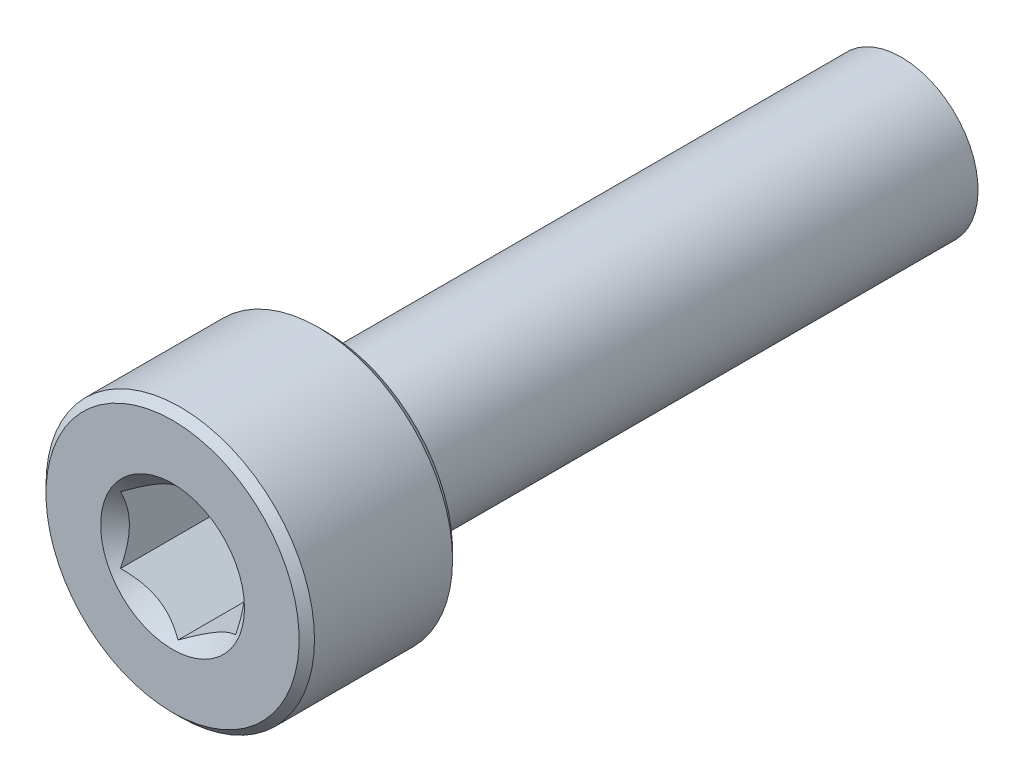
ISO-10303-21;
HEADER;
FILE_DESCRIPTION(('STEP AP214'),'2;1');
FILE_NAME('part.step','',(''),(''),'','','');
FILE_SCHEMA(('AUTOMOTIVE_DESIGN { 1 0 10303 214 1 1 1 1 }'));
ENDSEC;
DATA;
#1=APPLICATION_CONTEXT('core data for automotive mechanical design processes');
#2=APPLICATION_PROTOCOL_DEFINITION('international standard','automotive_design',2000,#1);
#3=PRODUCT_CONTEXT('',#1,'mechanical');
#4=PRODUCT('Part','Part','',(#3));
#5=PRODUCT_RELATED_PRODUCT_CATEGORY('part','',(#4));
#6=PRODUCT_DEFINITION_FORMATION('','',#4);
#7=PRODUCT_DEFINITION_CONTEXT('part definition',#1,'design');
#8=PRODUCT_DEFINITION('design','',#6,#7);
#9=PRODUCT_DEFINITION_SHAPE('','',#8);
#10=(LENGTH_UNIT() NAMED_UNIT(*) SI_UNIT(.MILLI.,.METRE.));
#11=(NAMED_UNIT(*) PLANE_ANGLE_UNIT() SI_UNIT($,.RADIAN.));
#12=(NAMED_UNIT(*) SI_UNIT($,.STERADIAN.) SOLID_ANGLE_UNIT());
#13=UNCERTAINTY_MEASURE_WITH_UNIT(LENGTH_MEASURE(1.E-05),#10,'distance_accuracy_value','');
#14=(GEOMETRIC_REPRESENTATION_CONTEXT(3) GLOBAL_UNCERTAINTY_ASSIGNED_CONTEXT((#13)) GLOBAL_UNIT_ASSIGNED_CONTEXT((#10,
#11,#12)) REPRESENTATION_CONTEXT('',''));
#15=CARTESIAN_POINT('',(0.,0.,0.));
#16=DIRECTION('',(0.,0.,1.));
#17=DIRECTION('',(1.,0.,0.));
#18=AXIS2_PLACEMENT_3D('',#15,#16,#17);
#19=CARTESIAN_POINT('',(0.,0.,-7.));
#20=DIRECTION('',(0.,0.,-1.));
#21=DIRECTION('',(0.,1.,0.));
#22=AXIS2_PLACEMENT_3D('',#19,#20,#21);
#23=CYLINDRICAL_SURFACE('',#22,2.);
#24=CARTESIAN_POINT('',(0.,0.,2.8));
#25=DIRECTION('',(0.,0.,-1.));
#26=DIRECTION('',(0.,1.,0.));
#27=AXIS2_PLACEMENT_3D('',#24,#25,#26);
#28=CIRCLE('',#27,2.);
#29=CARTESIAN_POINT('',(0.,2.,2.8));
#30=VERTEX_POINT('',#29);
#31=EDGE_CURVE('E54',#30,#30,#28,.T.);
#32=ORIENTED_EDGE('',*,*,#31,.T.);
#33=EDGE_LOOP('',(#32));
#34=FACE_BOUND('',#33,.T.);
#35=CARTESIAN_POINT('',(0.,0.,-12.));
#36=DIRECTION('',(0.,0.,-1.));
#37=DIRECTION('',(0.,1.,0.));
#38=AXIS2_PLACEMENT_3D('',#35,#36,#37);
#39=CIRCLE('',#38,2.);
#40=CARTESIAN_POINT('',(0.,2.,-12.));
#41=VERTEX_POINT('',#40);
#42=EDGE_CURVE('E359',#41,#41,#39,.T.);
#43=ORIENTED_EDGE('',*,*,#42,.F.);
#44=EDGE_LOOP('',(#43));
#45=FACE_BOUND('',#44,.T.);
#46=ADVANCED_FACE('F41',(#34,#45),#23,.T.);
#47=CARTESIAN_POINT('',(0.,0.,2.8));
#48=DIRECTION('',(0.,0.,-1.));
#49=DIRECTION('',(0.,1.,0.));
#50=AXIS2_PLACEMENT_3D('',#47,#48,#49);
#51=TOROIDAL_SURFACE('',#50,2.2,0.199999999999999);
#52=CARTESIAN_POINT('',(0.,0.,3.));
#53=DIRECTION('',(0.,0.,-1.));
#54=DIRECTION('',(0.,1.,0.));
#55=AXIS2_PLACEMENT_3D('',#52,#53,#54);
#56=CIRCLE('',#55,2.2);
#57=CARTESIAN_POINT('',(0.,2.2,3.));
#58=VERTEX_POINT('',#57);
#59=EDGE_CURVE('E151',#58,#58,#56,.T.);
#60=ORIENTED_EDGE('',*,*,#59,.T.);
#61=EDGE_LOOP('',(#60));
#62=FACE_BOUND('',#61,.T.);
#63=ORIENTED_EDGE('',*,*,#31,.F.);
#64=EDGE_LOOP('',(#63));
#65=FACE_BOUND('',#64,.T.);
#66=ADVANCED_FACE('F158',(#62,#65),#51,.F.);
#67=CARTESIAN_POINT('',(0.,3.3,3.));
#68=DIRECTION('',(0.,0.,-1.));
#69=DIRECTION('',(0.,1.,0.));
#70=AXIS2_PLACEMENT_3D('',#67,#68,#69);
#71=PLANE('',#70);
#72=CARTESIAN_POINT('',(0.,0.,3.));
#73=DIRECTION('',(0.,0.,-1.));
#74=DIRECTION('',(0.,1.,0.));
#75=AXIS2_PLACEMENT_3D('',#72,#73,#74);
#76=CIRCLE('',#75,3.3);
#77=CARTESIAN_POINT('',(0.,3.3,3.));
#78=VERTEX_POINT('',#77);
#79=EDGE_CURVE('E148',#78,#78,#76,.T.);
#80=ORIENTED_EDGE('',*,*,#79,.T.);
#81=EDGE_LOOP('',(#80));
#82=FACE_BOUND('',#81,.T.);
#83=ORIENTED_EDGE('',*,*,#59,.F.);
#84=EDGE_LOOP('',(#83));
#85=FACE_BOUND('',#84,.T.);
#86=ADVANCED_FACE('F160',(#82,#85),#71,.T.);
#87=CARTESIAN_POINT('',(0.,0.,3.));
#88=DIRECTION('',(0.,0.,1.));
#89=DIRECTION('',(0.,-1.,0.));
#90=AXIS2_PLACEMENT_3D('',#87,#88,#89);
#91=CONICAL_SURFACE('',#90,3.3,0.785398163397447);
#92=CARTESIAN_POINT('',(0.,0.,3.2));
#93=DIRECTION('',(0.,0.,-1.));
#94=DIRECTION('',(0.,1.,0.));
#95=AXIS2_PLACEMENT_3D('',#92,#93,#94);
#96=CIRCLE('',#95,3.5);
#97=CARTESIAN_POINT('',(0.,3.5,3.2));
#98=VERTEX_POINT('',#97);
#99=EDGE_CURVE('E145',#98,#98,#96,.T.);
#100=ORIENTED_EDGE('',*,*,#99,.T.);
#101=EDGE_LOOP('',(#100));
#102=FACE_BOUND('',#101,.T.);
#103=ORIENTED_EDGE('',*,*,#79,.F.);
#104=EDGE_LOOP('',(#103));
#105=FACE_BOUND('',#104,.T.);
#106=ADVANCED_FACE('F165',(#102,#105),#91,.T.);
#107=CARTESIAN_POINT('',(0.,0.,-7.));
#108=DIRECTION('',(0.,0.,-1.));
#109=DIRECTION('',(0.,1.,0.));
#110=AXIS2_PLACEMENT_3D('',#107,#108,#109);
#111=CYLINDRICAL_SURFACE('',#110,3.5);
#112=CARTESIAN_POINT('',(0.,0.,6.8));
#113=DIRECTION('',(0.,0.,-1.));
#114=DIRECTION('',(0.,1.,0.));
#115=AXIS2_PLACEMENT_3D('',#112,#113,#114);
#116=CIRCLE('',#115,3.5);
#117=CARTESIAN_POINT('',(0.,3.5,6.8));
#118=VERTEX_POINT('',#117);
#119=EDGE_CURVE('E142',#118,#118,#116,.T.);
#120=ORIENTED_EDGE('',*,*,#119,.T.);
#121=EDGE_LOOP('',(#120));
#122=FACE_BOUND('',#121,.T.);
#123=ORIENTED_EDGE('',*,*,#99,.F.);
#124=EDGE_LOOP('',(#123));
#125=FACE_BOUND('',#124,.T.);
#126=ADVANCED_FACE('F172',(#122,#125),#111,.T.);
#127=CARTESIAN_POINT('',(0.,0.,6.8));
#128=DIRECTION('',(0.,0.,-1.));
#129=DIRECTION('',(0.,1.,0.));
#130=AXIS2_PLACEMENT_3D('',#127,#128,#129);
#131=CONICAL_SURFACE('',#130,3.5,0.785398163397447);
#132=CARTESIAN_POINT('',(0.,0.,7.));
#133=DIRECTION('',(0.,0.,-1.));
#134=DIRECTION('',(0.,1.,0.));
#135=AXIS2_PLACEMENT_3D('',#132,#133,#134);
#136=CIRCLE('',#135,3.3);
#137=CARTESIAN_POINT('',(0.,3.3,7.));
#138=VERTEX_POINT('',#137);
#139=EDGE_CURVE('E139',#138,#138,#136,.T.);
#140=ORIENTED_EDGE('',*,*,#139,.T.);
#141=EDGE_LOOP('',(#140));
#142=FACE_BOUND('',#141,.T.);
#143=ORIENTED_EDGE('',*,*,#119,.F.);
#144=EDGE_LOOP('',(#143));
#145=FACE_BOUND('',#144,.T.);
#146=ADVANCED_FACE('F176',(#142,#145),#131,.T.);
#147=CARTESIAN_POINT('',(0.,0.,7.));
#148=DIRECTION('',(0.,0.,1.));
#149=DIRECTION('',(0.,-1.,0.));
#150=AXIS2_PLACEMENT_3D('',#147,#148,#149);
#151=PLANE('',#150);
#152=CARTESIAN_POINT('',(0.,0.,7.));
#153=DIRECTION('',(0.,0.,1.));
#154=DIRECTION('',(1.,0.,0.));
#155=AXIS2_PLACEMENT_3D('',#152,#153,#154);
#156=CIRCLE('',#155,1.875);
#157=CARTESIAN_POINT('',(1.875,0.,7.));
#158=VERTEX_POINT('',#157);
#159=EDGE_CURVE('E113',#158,#158,#156,.T.);
#160=ORIENTED_EDGE('',*,*,#159,.F.);
#161=EDGE_LOOP('',(#160));
#162=FACE_BOUND('',#161,.T.);
#163=ORIENTED_EDGE('',*,*,#139,.F.);
#164=EDGE_LOOP('',(#163));
#165=FACE_BOUND('',#164,.T.);
#166=ADVANCED_FACE('F180',(#162,#165),#151,.T.);
#167=CARTESIAN_POINT('',(0.,0.,7.));
#168=DIRECTION('',(0.,0.,1.));
#169=DIRECTION('',(1.,0.,0.));
#170=AXIS2_PLACEMENT_3D('',#167,#168,#169);
#171=CONICAL_SURFACE('',#170,1.875,0.78539816339745);
#172=ORIENTED_EDGE('',*,*,#159,.T.);
#173=EDGE_LOOP('',(#172));
#174=FACE_BOUND('',#173,.T.);
#175=CARTESIAN_POINT('',(-0.000200000000000217,-1.73216627762272,6.85716628916895));
#176=CARTESIAN_POINT('',(0.0513677907370753,-1.70239359975915,6.82741628363621));
#177=CARTESIAN_POINT('',(0.103797917665201,-1.67212305186355,6.79941329147919));
#178=CARTESIAN_POINT('',(0.210709034055597,-1.61039789003619,6.74814003800902));
#179=CARTESIAN_POINT('',(0.265200195814661,-1.57893740312614,6.72489831261325));
#180=CARTESIAN_POINT('',(0.375079081357249,-1.51549879897987,6.6850845365611));
#181=CARTESIAN_POINT('',(0.4304388090952,-1.4835368452681,6.66841239323977));
#182=CARTESIAN_POINT('',(0.542377257477151,-1.41890915196211,6.64272526438698));
#183=CARTESIAN_POINT('',(0.598952556553009,-1.38624538781118,6.63369109804774));
#184=CARTESIAN_POINT('',(0.696455389516442,-1.32995210095299,6.62553988879573));
#185=CARTESIAN_POINT('',(0.737256908280467,-1.30639533311124,6.6243330605581));
#186=CARTESIAN_POINT('',(0.818787969615859,-1.25932335290193,6.62636486473115));
#187=CARTESIAN_POINT('',(0.859517494314631,-1.23580815085313,6.62960447831719));
#188=CARTESIAN_POINT('',(0.940584402163417,-1.18900414978427,6.64034279355084));
#189=CARTESIAN_POINT('',(0.980921384598289,-1.16571558211719,6.64784546058761));
#190=CARTESIAN_POINT('',(1.06091833691403,-1.11952932016335,6.66670241949717));
#191=CARTESIAN_POINT('',(1.10057800851621,-1.09663179808786,6.67805836458746));
#192=CARTESIAN_POINT('',(1.20216313477449,-1.03798159809698,6.71177245516155));
#193=CARTESIAN_POINT('',(1.26345855370969,-1.00259267147465,6.73667265666225));
#194=CARTESIAN_POINT('',(1.35358562846331,-0.950557780604374,6.77870746084045));
#195=CARTESIAN_POINT('',(1.38328513990772,-0.933410759677147,6.79347596112797));
#196=CARTESIAN_POINT('',(1.44213790138375,-0.899432101996407,6.82436137350905));
#197=CARTESIAN_POINT('',(1.47129140422064,-0.88260031928571,6.84047764169059));
#198=CARTESIAN_POINT('',(1.5002,-0.865909933730601,6.85716628916895));
#199=B_SPLINE_CURVE_WITH_KNOTS('',3,(#175,#176,#177,#178,#179,#180,#181,#182,#183,#184,#185,
#186,#187,#188,#189,#190,#191,#192,#193,#194,#195,#196,#197,#198),.UNSPECIFIED.,.F.,.F.,(4,2,2,
2,2,2,2,2,2,2,2,4),(0.,0.199829143693305,0.400822987382389,0.598623720538182,0.795926240188891,
0.937113067959883,1.07833105577193,1.21968061668222,1.36109089931055,1.58570969637566,
1.69770705470964,1.80965120737194),.UNSPECIFIED.);
#200=CARTESIAN_POINT('',(0.,-1.73205080756888,6.85705080756888));
#201=VERTEX_POINT('',#200);
#202=CARTESIAN_POINT('',(1.5,-0.866025403784439,6.85705080756888));
#203=VERTEX_POINT('',#202);
#204=EDGE_CURVE('E12',#201,#203,#199,.T.);
#205=ORIENTED_EDGE('',*,*,#204,.F.);
#206=CARTESIAN_POINT('',(-1.5002,-0.865909933730601,6.85716628916895));
#207=CARTESIAN_POINT('',(-1.44863220926292,-0.895682611594166,6.82741628363621));
#208=CARTESIAN_POINT('',(-1.3962020823348,-0.925953159489765,6.79941329147919));
#209=CARTESIAN_POINT('',(-1.2892909659444,-0.987678321317123,6.74814003800902));
#210=CARTESIAN_POINT('',(-1.23479980418534,-1.01913880822717,6.72489831261325));
#211=CARTESIAN_POINT('',(-1.12492091864275,-1.08257741237344,6.6850845365611));
#212=CARTESIAN_POINT('',(-1.0695611909048,-1.11453936608521,6.66841239323977));
#213=CARTESIAN_POINT('',(-0.957622742522849,-1.1791670593912,6.64272526438698));
#214=CARTESIAN_POINT('',(-0.901047443446991,-1.21183082354213,6.63369109804774));
#215=CARTESIAN_POINT('',(-0.803544610483559,-1.26812411040032,6.62553988879573));
#216=CARTESIAN_POINT('',(-0.762743091719534,-1.29168087824208,6.62433306055809));
#217=CARTESIAN_POINT('',(-0.681212030384142,-1.33875285845138,6.62636486473115));
#218=CARTESIAN_POINT('',(-0.64048250568537,-1.36226806050018,6.62960447831719));
#219=CARTESIAN_POINT('',(-0.559415597836584,-1.40907206156905,6.64034279355084));
#220=CARTESIAN_POINT('',(-0.519078615401712,-1.43236062923612,6.64784546058761));
#221=CARTESIAN_POINT('',(-0.439081663085969,-1.47854689118996,6.66670241949717));
#222=CARTESIAN_POINT('',(-0.399421991483792,-1.50144441326545,6.67805836458746));
#223=CARTESIAN_POINT('',(-0.297836865225515,-1.56009461325633,6.71177245516155));
#224=CARTESIAN_POINT('',(-0.236541446290311,-1.59548353987866,6.73667265666225));
#225=CARTESIAN_POINT('',(-0.146414371536686,-1.64751843074894,6.77870746084045));
#226=CARTESIAN_POINT('',(-0.116714860092282,-1.66466545167617,6.79347596112797));
#227=CARTESIAN_POINT('',(-0.0578620986162489,-1.69864410935691,6.82436137350905));
#228=CARTESIAN_POINT('',(-0.0287085957793628,-1.71547589206761,6.84047764169059));
#229=CARTESIAN_POINT('',(0.000199999999999868,-1.73216627762272,6.85716628916895));
#230=B_SPLINE_CURVE_WITH_KNOTS('',3,(#206,#207,#208,#209,#210,#211,#212,#213,#214,#215,#216,
#217,#218,#219,#220,#221,#222,#223,#224,#225,#226,#227,#228,#229),.UNSPECIFIED.,.F.,.F.,(4,2,2,
2,2,2,2,2,2,2,2,4),(0.,0.199829143693305,0.400822987382388,0.59862372053818,0.795926240188889,
0.937113067959881,1.07833105577193,1.21968061668222,1.36109089931054,1.58570969637565,
1.69770705470964,1.80965120737194),.UNSPECIFIED.);
#231=CARTESIAN_POINT('',(-1.5,-0.866025403784439,6.85705080756888));
#232=VERTEX_POINT('',#231);
#233=EDGE_CURVE('E99',#232,#201,#230,.T.);
#234=ORIENTED_EDGE('',*,*,#233,.F.);
#235=CARTESIAN_POINT('',(-1.5,-1.82724616303013,7.4890703331983));
#236=CARTESIAN_POINT('',(-1.5,-1.78317586660663,7.45501239995677));
#237=CARTESIAN_POINT('',(-1.5,-1.73887128511932,7.4212586157948));
#238=CARTESIAN_POINT('',(-1.5,-1.64969483826883,7.35448777226094));
#239=CARTESIAN_POINT('',(-1.5,-1.60482284303167,7.32147088651893));
#240=CARTESIAN_POINT('',(-1.5,-1.46855205058729,7.22324713276));
#241=CARTESIAN_POINT('',(-1.5,-1.37616527732981,7.15938887980909));
#242=CARTESIAN_POINT('',(-1.5,-1.18175814530896,7.03306555241423));
#243=CARTESIAN_POINT('',(-1.5,-1.07950173722928,6.97096001610314));
#244=CARTESIAN_POINT('',(-1.5,-0.869762030917011,6.85669692365493));
#245=CARTESIAN_POINT('',(-1.5,-0.762297993140727,6.8045057692236));
#246=CARTESIAN_POINT('',(-1.5,-0.601919355462973,6.74062745548581));
#247=CARTESIAN_POINT('',(-1.5,-0.551595099321827,6.72247344848169));
#248=CARTESIAN_POINT('',(-1.5,-0.449644044337812,6.69019628138117));
#249=CARTESIAN_POINT('',(-1.5,-0.398017164202741,6.67607337353211));
#250=CARTESIAN_POINT('',(-1.5,-0.294682921970128,6.65286025130534));
#251=CARTESIAN_POINT('',(-1.5,-0.242996732973226,6.64367732834991));
#252=CARTESIAN_POINT('',(-1.5,-0.138960185913601,6.63054010534325));
#253=CARTESIAN_POINT('',(-1.5,-0.0866099744987001,6.62658467043386));
#254=CARTESIAN_POINT('',(-1.5,0.0158213358469601,6.62424944439602));
#255=CARTESIAN_POINT('',(-1.5,0.0658968533581893,6.62562321720099));
#256=CARTESIAN_POINT('',(-1.5,0.165665754885722,6.63330038456716));
#257=CARTESIAN_POINT('',(-1.5,0.215359104450809,6.63960421841715));
#258=CARTESIAN_POINT('',(-1.5,0.314848006923591,6.65688863172927));
#259=CARTESIAN_POINT('',(-1.5,0.364628847818078,6.66795253034827));
#260=CARTESIAN_POINT('',(-1.5,0.463087713283466,6.69413916239748));
#261=CARTESIAN_POINT('',(-1.5,0.511765792737121,6.7092616933524));
#262=CARTESIAN_POINT('',(-1.5,0.660788843897246,6.76136082058242));
#263=CARTESIAN_POINT('',(-1.5,0.759116657247093,6.80408886600696));
#264=CARTESIAN_POINT('',(-1.5,0.951184482463469,6.8991892536357));
#265=CARTESIAN_POINT('',(-1.5,1.04490689498041,6.95159542441679));
#266=CARTESIAN_POINT('',(-1.5,1.22407036992814,7.05981955502163));
#267=CARTESIAN_POINT('',(-1.5,1.30969196520694,7.11534242328386));
#268=CARTESIAN_POINT('',(-1.5,1.43583732283972,7.20122204414168));
#269=CARTESIAN_POINT('',(-1.5,1.47734359009407,7.23016065506323));
#270=CARTESIAN_POINT('',(-1.5,1.5597863256648,7.28881558305804));
#271=CARTESIAN_POINT('',(-1.5,1.60072294793761,7.31853168349227));
#272=CARTESIAN_POINT('',(-1.5,1.64142194027434,7.34857054891766));
#273=B_SPLINE_CURVE_WITH_KNOTS('',3,(#235,#236,#237,#238,#239,#240,#241,#242,#243,#244,#245,
#246,#247,#248,#249,#250,#251,#252,#253,#254,#255,#256,#257,#258,#259,#260,#261,#262,#263,#264,
#265,#266,#267,#268,#269,#270,#271,#272),.UNSPECIFIED.,.F.,.F.,(4,2,2,2,2,2,2,2,2,2,2,2,2,2,2,2,
2,2,4),(0.,0.16708643660166,0.33421183555128,0.671001298251587,1.02965358816391,
1.38706788816987,1.54743005800718,1.70780226036013,1.86504930542637,2.02226220743606,
2.17229379545786,2.32233875343611,2.47512433054573,2.62790228697088,2.94859878977715,
3.27043822191845,3.57642907004227,3.72821874189076,3.87996656039158),.UNSPECIFIED.);
#274=CARTESIAN_POINT('',(-1.5,0.866025403784438,6.85705080756888));
#275=VERTEX_POINT('',#274);
#276=EDGE_CURVE('E112',#275,#232,#273,.F.);
#277=ORIENTED_EDGE('',*,*,#276,.F.);
#278=CARTESIAN_POINT('',(0.000199999999999728,1.73216627762271,6.85716628916895));
#279=CARTESIAN_POINT('',(-0.0513677907370758,1.70239359975915,6.8274162836362));
#280=CARTESIAN_POINT('',(-0.103797917665201,1.67212305186355,6.79941329147919));
#281=CARTESIAN_POINT('',(-0.210709034055597,1.61039789003619,6.74814003800902));
#282=CARTESIAN_POINT('',(-0.265200195814662,1.57893740312614,6.72489831261325));
#283=CARTESIAN_POINT('',(-0.375079081357249,1.51549879897987,6.6850845365611));
#284=CARTESIAN_POINT('',(-0.4304388090952,1.4835368452681,6.66841239323977));
#285=CARTESIAN_POINT('',(-0.542377257477151,1.41890915196211,6.64272526438698));
#286=CARTESIAN_POINT('',(-0.598952556553009,1.38624538781118,6.63369109804774));
#287=CARTESIAN_POINT('',(-0.696455389516442,1.32995210095299,6.62553988879573));
#288=CARTESIAN_POINT('',(-0.737256908280467,1.30639533311124,6.62433306055809));
#289=CARTESIAN_POINT('',(-0.818787969615859,1.25932335290193,6.62636486473115));
#290=CARTESIAN_POINT('',(-0.859517494314631,1.23580815085313,6.62960447831719));
#291=CARTESIAN_POINT('',(-0.940584402163417,1.18900414978426,6.64034279355084));
#292=CARTESIAN_POINT('',(-0.980921384598289,1.16571558211719,6.64784546058761));
#293=CARTESIAN_POINT('',(-1.06091833691403,1.11952932016335,6.66670241949717));
#294=CARTESIAN_POINT('',(-1.10057800851621,1.09663179808786,6.67805836458746));
#295=CARTESIAN_POINT('',(-1.20216313477449,1.03798159809698,6.71177245516155));
#296=CARTESIAN_POINT('',(-1.26345855370969,1.00259267147465,6.73667265666225));
#297=CARTESIAN_POINT('',(-1.35358562846331,0.950557780604374,6.77870746084045));
#298=CARTESIAN_POINT('',(-1.38328513990772,0.933410759677147,6.79347596112797));
#299=CARTESIAN_POINT('',(-1.44213790138375,0.899432101996407,6.82436137350905));
#300=CARTESIAN_POINT('',(-1.47129140422064,0.88260031928571,6.84047764169059));
#301=CARTESIAN_POINT('',(-1.5002,0.8659099337306,6.85716628916895));
#302=B_SPLINE_CURVE_WITH_KNOTS('',3,(#278,#279,#280,#281,#282,#283,#284,#285,#286,#287,#288,
#289,#290,#291,#292,#293,#294,#295,#296,#297,#298,#299,#300,#301),.UNSPECIFIED.,.F.,.F.,(4,2,2,
2,2,2,2,2,2,2,2,4),(0.,0.199829143693305,0.400822987382389,0.598623720538182,0.79592624018889,
0.937113067959882,1.07833105577193,1.21968061668222,1.36109089931055,1.58570969637566,
1.69770705470964,1.80965120737194),.UNSPECIFIED.);
#303=CARTESIAN_POINT('',(0.,1.73205080756888,6.85705080756888));
#304=VERTEX_POINT('',#303);
#305=EDGE_CURVE('E232',#304,#275,#302,.T.);
#306=ORIENTED_EDGE('',*,*,#305,.F.);
#307=CARTESIAN_POINT('',(1.5002,0.865909933730601,6.85716628916895));
#308=CARTESIAN_POINT('',(1.44863220926292,0.895682611594165,6.82741628363621));
#309=CARTESIAN_POINT('',(1.3962020823348,0.925953159489765,6.79941329147919));
#310=CARTESIAN_POINT('',(1.2892909659444,0.987678321317123,6.74814003800902));
#311=CARTESIAN_POINT('',(1.23479980418534,1.01913880822717,6.72489831261325));
#312=CARTESIAN_POINT('',(1.12492091864275,1.08257741237344,6.6850845365611));
#313=CARTESIAN_POINT('',(1.0695611909048,1.11453936608521,6.66841239323977));
#314=CARTESIAN_POINT('',(0.957622742522849,1.1791670593912,6.64272526438698));
#315=CARTESIAN_POINT('',(0.901047443446991,1.21183082354213,6.63369109804774));
#316=CARTESIAN_POINT('',(0.803544610483559,1.26812411040032,6.62553988879573));
#317=CARTESIAN_POINT('',(0.762743091719533,1.29168087824208,6.62433306055809));
#318=CARTESIAN_POINT('',(0.681212030384141,1.33875285845138,6.62636486473115));
#319=CARTESIAN_POINT('',(0.640482505685369,1.36226806050018,6.62960447831718));
#320=CARTESIAN_POINT('',(0.559415597836583,1.40907206156905,6.64034279355084));
#321=CARTESIAN_POINT('',(0.519078615401712,1.43236062923612,6.64784546058761));
#322=CARTESIAN_POINT('',(0.439081663085969,1.47854689118996,6.66670241949717));
#323=CARTESIAN_POINT('',(0.399421991483792,1.50144441326545,6.67805836458746));
#324=CARTESIAN_POINT('',(0.297836865225514,1.56009461325633,6.71177245516155));
#325=CARTESIAN_POINT('',(0.23654144629031,1.59548353987866,6.73667265666224));
#326=CARTESIAN_POINT('',(0.146414371536686,1.64751843074894,6.77870746084045));
#327=CARTESIAN_POINT('',(0.116714860092282,1.66466545167617,6.79347596112797));
#328=CARTESIAN_POINT('',(0.0578620986162486,1.69864410935691,6.82436137350905));
#329=CARTESIAN_POINT('',(0.0287085957793623,1.71547589206761,6.84047764169059));
#330=CARTESIAN_POINT('',(-0.000200000000000577,1.73216627762271,6.85716628916895));
#331=B_SPLINE_CURVE_WITH_KNOTS('',3,(#307,#308,#309,#310,#311,#312,#313,#314,#315,#316,#317,
#318,#319,#320,#321,#322,#323,#324,#325,#326,#327,#328,#329,#330),.UNSPECIFIED.,.F.,.F.,(4,2,2,
2,2,2,2,2,2,2,2,4),(0.,0.199829143693304,0.400822987382389,0.598623720538182,0.79592624018889,
0.937113067959882,1.07833105577193,1.21968061668222,1.36109089931054,1.58570969637565,
1.69770705470964,1.80965120737194),.UNSPECIFIED.);
#332=CARTESIAN_POINT('',(1.5,0.866025403784438,6.85705080756888));
#333=VERTEX_POINT('',#332);
#334=EDGE_CURVE('E204',#333,#304,#331,.T.);
#335=ORIENTED_EDGE('',*,*,#334,.F.);
#336=CARTESIAN_POINT('',(1.5,-1.82724616303013,7.4890703331983));
#337=CARTESIAN_POINT('',(1.5,-1.78317586660663,7.45501239995677));
#338=CARTESIAN_POINT('',(1.5,-1.73887128511932,7.4212586157948));
#339=CARTESIAN_POINT('',(1.5,-1.64969483826883,7.35448777226094));
#340=CARTESIAN_POINT('',(1.5,-1.60482284303166,7.32147088651893));
#341=CARTESIAN_POINT('',(1.5,-1.46855205058729,7.22324713276));
#342=CARTESIAN_POINT('',(1.5,-1.37616527732981,7.15938887980909));
#343=CARTESIAN_POINT('',(1.5,-1.18175814530896,7.03306555241423));
#344=CARTESIAN_POINT('',(1.5,-1.07950173722928,6.97096001610314));
#345=CARTESIAN_POINT('',(1.5,-0.869762030917009,6.85669692365493));
#346=CARTESIAN_POINT('',(1.5,-0.762297993140726,6.8045057692236));
#347=CARTESIAN_POINT('',(1.5,-0.601919355462973,6.74062745548581));
#348=CARTESIAN_POINT('',(1.5,-0.551595099321827,6.72247344848169));
#349=CARTESIAN_POINT('',(1.5,-0.449644044337812,6.69019628138117));
#350=CARTESIAN_POINT('',(1.5,-0.398017164202741,6.67607337353211));
#351=CARTESIAN_POINT('',(1.5,-0.294682921970128,6.65286025130534));
#352=CARTESIAN_POINT('',(1.5,-0.242996732973227,6.64367732834991));
#353=CARTESIAN_POINT('',(1.5,-0.138960185913602,6.63054010534325));
#354=CARTESIAN_POINT('',(1.5,-0.0866099744987009,6.62658467043386));
#355=CARTESIAN_POINT('',(1.5,0.0158213358469593,6.62424944439602));
#356=CARTESIAN_POINT('',(1.5,0.0658968533581886,6.62562321720099));
#357=CARTESIAN_POINT('',(1.5,0.165665754885722,6.63330038456716));
#358=CARTESIAN_POINT('',(1.5,0.215359104450808,6.63960421841715));
#359=CARTESIAN_POINT('',(1.5,0.314848006923591,6.65688863172927));
#360=CARTESIAN_POINT('',(1.5,0.364628847818077,6.66795253034827));
#361=CARTESIAN_POINT('',(1.5,0.463087713283465,6.69413916239748));
#362=CARTESIAN_POINT('',(1.5,0.511765792737121,6.7092616933524));
#363=CARTESIAN_POINT('',(1.5,0.660788843897245,6.76136082058242));
#364=CARTESIAN_POINT('',(1.5,0.759116657247092,6.80408886600696));
#365=CARTESIAN_POINT('',(1.5,0.951184482463468,6.8991892536357));
#366=CARTESIAN_POINT('',(1.5,1.04490689498041,6.95159542441679));
#367=CARTESIAN_POINT('',(1.5,1.22407036992814,7.05981955502163));
#368=CARTESIAN_POINT('',(1.5,1.30969196520694,7.11534242328386));
#369=CARTESIAN_POINT('',(1.5,1.43583732283972,7.20122204414168));
#370=CARTESIAN_POINT('',(1.5,1.47734359009407,7.23016065506323));
#371=CARTESIAN_POINT('',(1.5,1.55978632566479,7.28881558305803));
#372=CARTESIAN_POINT('',(1.5,1.60072294793761,7.31853168349227));
#373=CARTESIAN_POINT('',(1.5,1.64142194027434,7.34857054891766));
#374=B_SPLINE_CURVE_WITH_KNOTS('',3,(#336,#337,#338,#339,#340,#341,#342,#343,#344,#345,#346,
#347,#348,#349,#350,#351,#352,#353,#354,#355,#356,#357,#358,#359,#360,#361,#362,#363,#364,#365,
#366,#367,#368,#369,#370,#371,#372,#373),.UNSPECIFIED.,.F.,.F.,(4,2,2,2,2,2,2,2,2,2,2,2,2,2,2,2,
2,2,4),(0.,0.16708643660166,0.33421183555128,0.671001298251586,1.02965358816391,
1.38706788816987,1.54743005800718,1.70780226036013,1.86504930542636,2.02226220743606,
2.17229379545786,2.3223387534361,2.47512433054573,2.62790228697088,2.94859878977715,
3.27043822191844,3.57642907004227,3.72821874189075,3.87996656039158),.UNSPECIFIED.);
#375=EDGE_CURVE('E61',#203,#333,#374,.T.);
#376=ORIENTED_EDGE('',*,*,#375,.F.);
#377=EDGE_LOOP('',(#205,#234,#277,#306,#335,#376));
#378=FACE_BOUND('',#377,.T.);
#379=ADVANCED_FACE('F98',(#174,#378),#171,.F.);
#380=CARTESIAN_POINT('',(0.,3.3,4.));
#381=DIRECTION('',(0.,0.,-1.));
#382=DIRECTION('',(0.,1.,0.));
#383=AXIS2_PLACEMENT_3D('',#380,#381,#382);
#384=PLANE('',#383);
#385=DIRECTION('',(0.866025403784439,0.5,0.));
#386=VECTOR('',#385,1.);
#387=CARTESIAN_POINT('',(0.,-1.73205080756888,4.));
#388=LINE('',#387,#386);
#389=CARTESIAN_POINT('',(0.,-1.73205080756888,4.));
#390=VERTEX_POINT('',#389);
#391=CARTESIAN_POINT('',(1.5,-0.866025403784439,4.));
#392=VERTEX_POINT('',#391);
#393=EDGE_CURVE('E116',#390,#392,#388,.T.);
#394=ORIENTED_EDGE('',*,*,#393,.T.);
#395=DIRECTION('',(0.,1.,0.));
#396=VECTOR('',#395,1.);
#397=CARTESIAN_POINT('',(1.5,-0.866025403784439,4.));
#398=LINE('',#397,#396);
#399=CARTESIAN_POINT('',(1.5,0.866025403784438,4.));
#400=VERTEX_POINT('',#399);
#401=EDGE_CURVE('E68',#392,#400,#398,.T.);
#402=ORIENTED_EDGE('',*,*,#401,.T.);
#403=DIRECTION('',(-0.866025403784439,0.5,0.));
#404=VECTOR('',#403,1.);
#405=CARTESIAN_POINT('',(1.5,0.866025403784438,4.));
#406=LINE('',#405,#404);
#407=CARTESIAN_POINT('',(0.,1.73205080756888,4.));
#408=VERTEX_POINT('',#407);
#409=EDGE_CURVE('E124',#400,#408,#406,.T.);
#410=ORIENTED_EDGE('',*,*,#409,.T.);
#411=DIRECTION('',(-0.866025403784439,-0.5,0.));
#412=VECTOR('',#411,1.);
#413=CARTESIAN_POINT('',(0.,1.73205080756888,4.));
#414=LINE('',#413,#412);
#415=CARTESIAN_POINT('',(-1.5,0.866025403784439,4.));
#416=VERTEX_POINT('',#415);
#417=EDGE_CURVE('E131',#408,#416,#414,.T.);
#418=ORIENTED_EDGE('',*,*,#417,.T.);
#419=DIRECTION('',(0.,-1.,0.));
#420=VECTOR('',#419,1.);
#421=CARTESIAN_POINT('',(-1.5,0.866025403784438,4.));
#422=LINE('',#421,#420);
#423=CARTESIAN_POINT('',(-1.5,-0.866025403784439,4.));
#424=VERTEX_POINT('',#423);
#425=EDGE_CURVE('E127',#416,#424,#422,.T.);
#426=ORIENTED_EDGE('',*,*,#425,.T.);
#427=DIRECTION('',(0.866025403784439,-0.5,0.));
#428=VECTOR('',#427,1.);
#429=CARTESIAN_POINT('',(-1.5,-0.866025403784439,4.));
#430=LINE('',#429,#428);
#431=EDGE_CURVE('E117',#424,#390,#430,.T.);
#432=ORIENTED_EDGE('',*,*,#431,.T.);
#433=EDGE_LOOP('',(#394,#402,#410,#418,#426,#432));
#434=FACE_BOUND('',#433,.T.);
#435=ADVANCED_FACE('F185',(#434),#384,.F.);
#436=CARTESIAN_POINT('',(0.,-1.73205080756888,-1.58257569495584));
#437=DIRECTION('',(0.5,-0.866025403784439,0.));
#438=DIRECTION('',(0.866025403784439,0.5,0.));
#439=AXIS2_PLACEMENT_3D('',#436,#437,#438);
#440=PLANE('',#439);
#441=DIRECTION('',(0.,0.,1.));
#442=VECTOR('',#441,1.);
#443=CARTESIAN_POINT('',(0.,-1.73205080756888,-1.58257569495584));
#444=LINE('',#443,#442);
#445=EDGE_CURVE('E108',#390,#201,#444,.T.);
#446=ORIENTED_EDGE('',*,*,#445,.T.);
#447=ORIENTED_EDGE('',*,*,#204,.T.);
#448=DIRECTION('',(0.,0.,1.));
#449=VECTOR('',#448,1.);
#450=CARTESIAN_POINT('',(1.5,-0.866025403784439,-1.58257569495584));
#451=LINE('',#450,#449);
#452=EDGE_CURVE('E119',#392,#203,#451,.T.);
#453=ORIENTED_EDGE('',*,*,#452,.F.);
#454=ORIENTED_EDGE('',*,*,#393,.F.);
#455=EDGE_LOOP('',(#446,#447,#453,#454));
#456=FACE_BOUND('',#455,.T.);
#457=ADVANCED_FACE('F115',(#456),#440,.F.);
#458=CARTESIAN_POINT('',(-1.5,-0.866025403784439,-1.58257569495584));
#459=DIRECTION('',(-0.5,-0.866025403784439,0.));
#460=DIRECTION('',(0.866025403784439,-0.5,0.));
#461=AXIS2_PLACEMENT_3D('',#458,#459,#460);
#462=PLANE('',#461);
#463=DIRECTION('',(0.,0.,1.));
#464=VECTOR('',#463,1.);
#465=CARTESIAN_POINT('',(-1.5,-0.866025403784439,-1.58257569495584));
#466=LINE('',#465,#464);
#467=EDGE_CURVE('E111',#424,#232,#466,.T.);
#468=ORIENTED_EDGE('',*,*,#467,.T.);
#469=ORIENTED_EDGE('',*,*,#233,.T.);
#470=ORIENTED_EDGE('',*,*,#445,.F.);
#471=ORIENTED_EDGE('',*,*,#431,.F.);
#472=EDGE_LOOP('',(#468,#469,#470,#471));
#473=FACE_BOUND('',#472,.T.);
#474=ADVANCED_FACE('F107',(#473),#462,.F.);
#475=CARTESIAN_POINT('',(-1.5,0.866025403784438,-1.58257569495584));
#476=DIRECTION('',(-1.,0.,0.));
#477=DIRECTION('',(0.,0.,1.));
#478=AXIS2_PLACEMENT_3D('',#475,#476,#477);
#479=PLANE('',#478);
#480=DIRECTION('',(0.,0.,1.));
#481=VECTOR('',#480,1.);
#482=CARTESIAN_POINT('',(-1.5,0.866025403784438,-1.58257569495584));
#483=LINE('',#482,#481);
#484=EDGE_CURVE('E128',#416,#275,#483,.T.);
#485=ORIENTED_EDGE('',*,*,#484,.T.);
#486=ORIENTED_EDGE('',*,*,#276,.T.);
#487=ORIENTED_EDGE('',*,*,#467,.F.);
#488=ORIENTED_EDGE('',*,*,#425,.F.);
#489=EDGE_LOOP('',(#485,#486,#487,#488));
#490=FACE_BOUND('',#489,.T.);
#491=ADVANCED_FACE('F241',(#490),#479,.F.);
#492=CARTESIAN_POINT('',(0.,1.73205080756888,-1.58257569495584));
#493=DIRECTION('',(-0.5,0.866025403784439,0.));
#494=DIRECTION('',(-0.866025403784439,-0.5,0.));
#495=AXIS2_PLACEMENT_3D('',#492,#493,#494);
#496=PLANE('',#495);
#497=DIRECTION('',(0.,0.,1.));
#498=VECTOR('',#497,1.);
#499=CARTESIAN_POINT('',(0.,1.73205080756888,-1.58257569495584));
#500=LINE('',#499,#498);
#501=EDGE_CURVE('E132',#408,#304,#500,.T.);
#502=ORIENTED_EDGE('',*,*,#501,.T.);
#503=ORIENTED_EDGE('',*,*,#305,.T.);
#504=ORIENTED_EDGE('',*,*,#484,.F.);
#505=ORIENTED_EDGE('',*,*,#417,.F.);
#506=EDGE_LOOP('',(#502,#503,#504,#505));
#507=FACE_BOUND('',#506,.T.);
#508=ADVANCED_FACE('F238',(#507),#496,.F.);
#509=CARTESIAN_POINT('',(1.5,0.866025403784438,-1.58257569495584));
#510=DIRECTION('',(0.5,0.866025403784439,0.));
#511=DIRECTION('',(-0.866025403784439,0.5,0.));
#512=AXIS2_PLACEMENT_3D('',#509,#510,#511);
#513=PLANE('',#512);
#514=DIRECTION('',(0.,0.,1.));
#515=VECTOR('',#514,1.);
#516=CARTESIAN_POINT('',(1.5,0.866025403784438,-1.58257569495584));
#517=LINE('',#516,#515);
#518=EDGE_CURVE('E135',#400,#333,#517,.T.);
#519=ORIENTED_EDGE('',*,*,#518,.T.);
#520=ORIENTED_EDGE('',*,*,#334,.T.);
#521=ORIENTED_EDGE('',*,*,#501,.F.);
#522=ORIENTED_EDGE('',*,*,#409,.F.);
#523=EDGE_LOOP('',(#519,#520,#521,#522));
#524=FACE_BOUND('',#523,.T.);
#525=ADVANCED_FACE('F194',(#524),#513,.F.);
#526=CARTESIAN_POINT('',(1.5,-0.866025403784439,-1.58257569495584));
#527=DIRECTION('',(1.,0.,0.));
#528=DIRECTION('',(0.,0.,-1.));
#529=AXIS2_PLACEMENT_3D('',#526,#527,#528);
#530=PLANE('',#529);
#531=ORIENTED_EDGE('',*,*,#452,.T.);
#532=ORIENTED_EDGE('',*,*,#375,.T.);
#533=ORIENTED_EDGE('',*,*,#518,.F.);
#534=ORIENTED_EDGE('',*,*,#401,.F.);
#535=EDGE_LOOP('',(#531,#532,#533,#534));
#536=FACE_BOUND('',#535,.T.);
#537=ADVANCED_FACE('F189',(#536),#530,.F.);
#538=CARTESIAN_POINT('',(0.,0.,-12.));
#539=DIRECTION('',(0.,0.,-1.));
#540=DIRECTION('',(0.,1.,0.));
#541=AXIS2_PLACEMENT_3D('',#538,#539,#540);
#542=PLANE('',#541);
#543=ORIENTED_EDGE('',*,*,#42,.T.);
#544=EDGE_LOOP('',(#543));
#545=FACE_BOUND('',#544,.T.);
#546=ADVANCED_FACE('F193',(#545),#542,.T.);
#547=CLOSED_SHELL('',(#46,#66,#86,#106,#126,#146,#166,#379,#435,#457,#474,#491,#508,#525,#537,#546));
#548=MANIFOLD_SOLID_BREP('B2',#547);
#549=ADVANCED_BREP_SHAPE_REPRESENTATION('',(#18,#548),#14);
#550=SHAPE_DEFINITION_REPRESENTATION(#9,#549);
ENDSEC;
END-ISO-10303-21;
